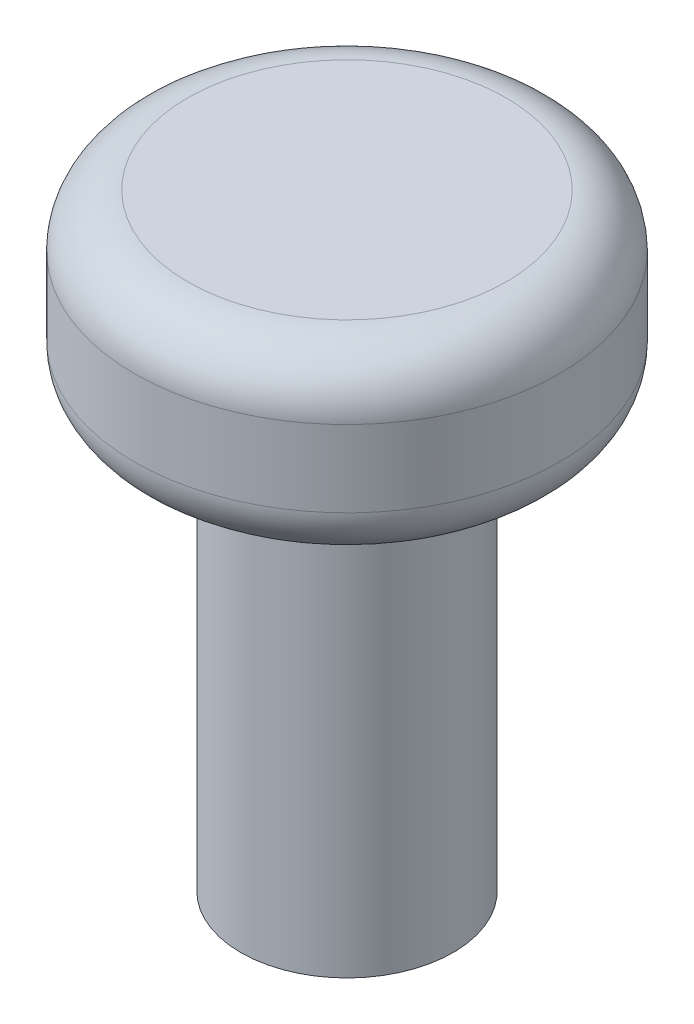
ISO-10303-21;
HEADER;
FILE_DESCRIPTION(('STEP AP214'),'2;1');
FILE_NAME('part.step','',(''),(''),'','','');
FILE_SCHEMA(('AUTOMOTIVE_DESIGN { 1 0 10303 214 1 1 1 1 }'));
ENDSEC;
DATA;
#1=APPLICATION_CONTEXT('core data for automotive mechanical design processes');
#2=APPLICATION_PROTOCOL_DEFINITION('international standard','automotive_design',2000,#1);
#3=PRODUCT_CONTEXT('',#1,'mechanical');
#4=PRODUCT('Part','Part','',(#3));
#5=PRODUCT_RELATED_PRODUCT_CATEGORY('part','',(#4));
#6=PRODUCT_DEFINITION_FORMATION('','',#4);
#7=PRODUCT_DEFINITION_CONTEXT('part definition',#1,'design');
#8=PRODUCT_DEFINITION('design','',#6,#7);
#9=PRODUCT_DEFINITION_SHAPE('','',#8);
#10=(LENGTH_UNIT() NAMED_UNIT(*) SI_UNIT(.MILLI.,.METRE.));
#11=(NAMED_UNIT(*) PLANE_ANGLE_UNIT() SI_UNIT($,.RADIAN.));
#12=(NAMED_UNIT(*) SI_UNIT($,.STERADIAN.) SOLID_ANGLE_UNIT());
#13=UNCERTAINTY_MEASURE_WITH_UNIT(LENGTH_MEASURE(1.E-05),#10,'distance_accuracy_value','');
#14=(GEOMETRIC_REPRESENTATION_CONTEXT(3) GLOBAL_UNCERTAINTY_ASSIGNED_CONTEXT((#13)) GLOBAL_UNIT_ASSIGNED_CONTEXT((#10,
#11,#12)) REPRESENTATION_CONTEXT('',''));
#15=CARTESIAN_POINT('',(0.,0.,0.));
#16=DIRECTION('',(0.,0.,1.));
#17=DIRECTION('',(1.,0.,0.));
#18=AXIS2_PLACEMENT_3D('',#15,#16,#17);
#19=CARTESIAN_POINT('',(0.,0.,0.));
#20=DIRECTION('',(0.,-1.,0.));
#21=DIRECTION('',(0.,0.,-1.));
#22=AXIS2_PLACEMENT_3D('',#19,#20,#21);
#23=PLANE('',#22);
#24=CARTESIAN_POINT('',(0.,0.,0.));
#25=DIRECTION('',(0.,1.,0.));
#26=DIRECTION('',(0.,0.,1.));
#27=AXIS2_PLACEMENT_3D('',#24,#25,#26);
#28=CIRCLE('',#27,1.);
#29=CARTESIAN_POINT('',(0.,0.,1.));
#30=VERTEX_POINT('',#29);
#31=EDGE_CURVE('E59',#30,#30,#28,.T.);
#32=ORIENTED_EDGE('',*,*,#31,.F.);
#33=EDGE_LOOP('',(#32));
#34=FACE_BOUND('',#33,.T.);
#35=ADVANCED_FACE('F39',(#34),#23,.T.);
#36=CARTESIAN_POINT('',(0.,5.72,0.));
#37=DIRECTION('',(0.,1.,0.));
#38=DIRECTION('',(0.,0.,1.));
#39=AXIS2_PLACEMENT_3D('',#36,#37,#38);
#40=CYLINDRICAL_SURFACE('',#39,1.);
#41=ORIENTED_EDGE('',*,*,#31,.T.);
#42=EDGE_LOOP('',(#41));
#43=FACE_BOUND('',#42,.T.);
#44=CARTESIAN_POINT('',(0.,4.,0.));
#45=DIRECTION('',(0.,1.,0.));
#46=DIRECTION('',(0.,0.,1.));
#47=AXIS2_PLACEMENT_3D('',#44,#45,#46);
#48=CIRCLE('',#47,1.);
#49=CARTESIAN_POINT('',(0.,4.,1.));
#50=VERTEX_POINT('',#49);
#51=EDGE_CURVE('E62',#50,#50,#48,.T.);
#52=ORIENTED_EDGE('',*,*,#51,.F.);
#53=EDGE_LOOP('',(#52));
#54=FACE_BOUND('',#53,.T.);
#55=ADVANCED_FACE('F68',(#43,#54),#40,.T.);
#56=CARTESIAN_POINT('',(-1.,4.,0.));
#57=DIRECTION('',(0.,-1.,0.));
#58=DIRECTION('',(0.,0.,-1.));
#59=AXIS2_PLACEMENT_3D('',#56,#57,#58);
#60=PLANE('',#59);
#61=CARTESIAN_POINT('',(0.,4.,0.));
#62=DIRECTION('',(0.,-1.,0.));
#63=DIRECTION('',(0.,0.,-1.));
#64=AXIS2_PLACEMENT_3D('',#61,#62,#63);
#65=CIRCLE('',#64,1.5);
#66=CARTESIAN_POINT('',(0.,4.,-1.5));
#67=VERTEX_POINT('',#66);
#68=EDGE_CURVE('E46',#67,#67,#65,.T.);
#69=ORIENTED_EDGE('',*,*,#68,.T.);
#70=EDGE_LOOP('',(#69));
#71=FACE_BOUND('',#70,.T.);
#72=ORIENTED_EDGE('',*,*,#51,.T.);
#73=EDGE_LOOP('',(#72));
#74=FACE_BOUND('',#73,.T.);
#75=ADVANCED_FACE('F66',(#71,#74),#60,.T.);
#76=CARTESIAN_POINT('',(0.,5.72,0.));
#77=DIRECTION('',(0.,1.,0.));
#78=DIRECTION('',(0.,0.,1.));
#79=AXIS2_PLACEMENT_3D('',#76,#77,#78);
#80=CYLINDRICAL_SURFACE('',#79,2.);
#81=CARTESIAN_POINT('',(0.,4.5,0.));
#82=DIRECTION('',(0.,-1.,0.));
#83=DIRECTION('',(0.,0.,-1.));
#84=AXIS2_PLACEMENT_3D('',#81,#82,#83);
#85=CIRCLE('',#84,2.);
#86=CARTESIAN_POINT('',(0.,4.5,-2.));
#87=VERTEX_POINT('',#86);
#88=EDGE_CURVE('E50',#87,#87,#85,.F.);
#89=ORIENTED_EDGE('',*,*,#88,.T.);
#90=EDGE_LOOP('',(#89));
#91=FACE_BOUND('',#90,.T.);
#92=CARTESIAN_POINT('',(0.,5.22,0.));
#93=DIRECTION('',(0.,1.,0.));
#94=DIRECTION('',(0.,0.,1.));
#95=AXIS2_PLACEMENT_3D('',#92,#93,#94);
#96=CIRCLE('',#95,2.);
#97=CARTESIAN_POINT('',(0.,5.22,2.));
#98=VERTEX_POINT('',#97);
#99=EDGE_CURVE('E54',#98,#98,#96,.F.);
#100=ORIENTED_EDGE('',*,*,#99,.T.);
#101=EDGE_LOOP('',(#100));
#102=FACE_BOUND('',#101,.T.);
#103=ADVANCED_FACE('F76',(#91,#102),#80,.T.);
#104=CARTESIAN_POINT('',(-2.,5.72,0.));
#105=DIRECTION('',(0.,1.,0.));
#106=DIRECTION('',(0.,0.,1.));
#107=AXIS2_PLACEMENT_3D('',#104,#105,#106);
#108=PLANE('',#107);
#109=CARTESIAN_POINT('',(0.,5.72,0.));
#110=DIRECTION('',(0.,1.,0.));
#111=DIRECTION('',(0.,0.,1.));
#112=AXIS2_PLACEMENT_3D('',#109,#110,#111);
#113=CIRCLE('',#112,1.5);
#114=CARTESIAN_POINT('',(0.,5.72,1.5));
#115=VERTEX_POINT('',#114);
#116=EDGE_CURVE('E10',#115,#115,#113,.T.);
#117=ORIENTED_EDGE('',*,*,#116,.T.);
#118=EDGE_LOOP('',(#117));
#119=FACE_BOUND('',#118,.T.);
#120=ADVANCED_FACE('F83',(#119),#108,.T.);
#121=CARTESIAN_POINT('',(0.,4.5,0.));
#122=DIRECTION('',(0.,-1.,0.));
#123=DIRECTION('',(0.,0.,-1.));
#124=AXIS2_PLACEMENT_3D('',#121,#122,#123);
#125=TOROIDAL_SURFACE('',#124,1.5,0.5);
#126=ORIENTED_EDGE('',*,*,#68,.F.);
#127=EDGE_LOOP('',(#126));
#128=FACE_BOUND('',#127,.T.);
#129=ORIENTED_EDGE('',*,*,#88,.F.);
#130=EDGE_LOOP('',(#129));
#131=FACE_BOUND('',#130,.T.);
#132=ADVANCED_FACE('F81',(#128,#131),#125,.T.);
#133=CARTESIAN_POINT('',(0.,5.22,0.));
#134=DIRECTION('',(0.,1.,0.));
#135=DIRECTION('',(0.,0.,1.));
#136=AXIS2_PLACEMENT_3D('',#133,#134,#135);
#137=TOROIDAL_SURFACE('',#136,1.5,0.5);
#138=ORIENTED_EDGE('',*,*,#99,.F.);
#139=EDGE_LOOP('',(#138));
#140=FACE_BOUND('',#139,.T.);
#141=ORIENTED_EDGE('',*,*,#116,.F.);
#142=EDGE_LOOP('',(#141));
#143=FACE_BOUND('',#142,.T.);
#144=ADVANCED_FACE('F41',(#140,#143),#137,.T.);
#145=CLOSED_SHELL('',(#35,#55,#75,#103,#120,#132,#144));
#146=MANIFOLD_SOLID_BREP('B2',#145);
#147=ADVANCED_BREP_SHAPE_REPRESENTATION('',(#18,#146),#14);
#148=SHAPE_DEFINITION_REPRESENTATION(#9,#147);
ENDSEC;
END-ISO-10303-21;
